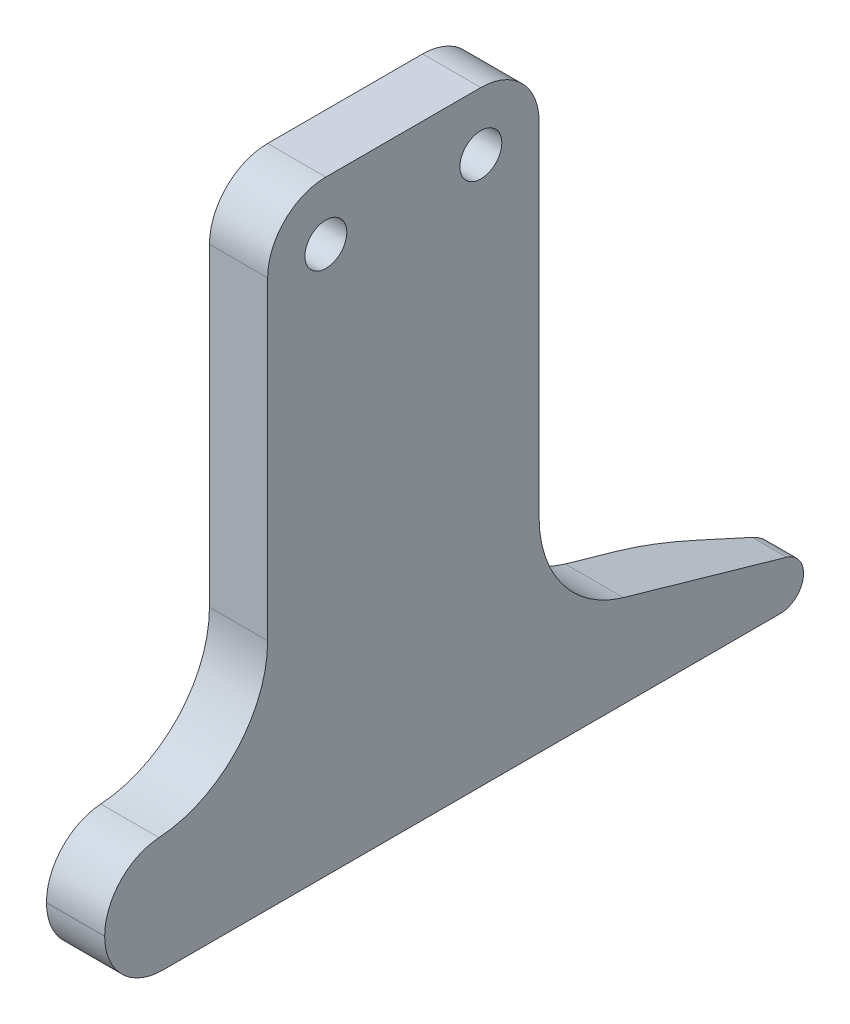
ISO-10303-21;
HEADER;
FILE_DESCRIPTION(('STEP AP214'),'2;1');
FILE_NAME('part.step','',(''),(''),'','','');
FILE_SCHEMA(('AUTOMOTIVE_DESIGN { 1 0 10303 214 1 1 1 1 }'));
ENDSEC;
DATA;
#1=APPLICATION_CONTEXT('core data for automotive mechanical design processes');
#2=APPLICATION_PROTOCOL_DEFINITION('international standard','automotive_design',2000,#1);
#3=PRODUCT_CONTEXT('',#1,'mechanical');
#4=PRODUCT('Part','Part','',(#3));
#5=PRODUCT_RELATED_PRODUCT_CATEGORY('part','',(#4));
#6=PRODUCT_DEFINITION_FORMATION('','',#4);
#7=PRODUCT_DEFINITION_CONTEXT('part definition',#1,'design');
#8=PRODUCT_DEFINITION('design','',#6,#7);
#9=PRODUCT_DEFINITION_SHAPE('','',#8);
#10=(LENGTH_UNIT() NAMED_UNIT(*) SI_UNIT(.MILLI.,.METRE.));
#11=(NAMED_UNIT(*) PLANE_ANGLE_UNIT() SI_UNIT($,.RADIAN.));
#12=(NAMED_UNIT(*) SI_UNIT($,.STERADIAN.) SOLID_ANGLE_UNIT());
#13=UNCERTAINTY_MEASURE_WITH_UNIT(LENGTH_MEASURE(1.E-05),#10,'distance_accuracy_value','');
#14=(GEOMETRIC_REPRESENTATION_CONTEXT(3) GLOBAL_UNCERTAINTY_ASSIGNED_CONTEXT((#13)) GLOBAL_UNIT_ASSIGNED_CONTEXT((#10,
#11,#12)) REPRESENTATION_CONTEXT('',''));
#15=CARTESIAN_POINT('',(0.,0.,0.));
#16=DIRECTION('',(0.,0.,1.));
#17=DIRECTION('',(1.,0.,0.));
#18=AXIS2_PLACEMENT_3D('',#15,#16,#17);
#19=CARTESIAN_POINT('',(6.35,0.,0.));
#20=DIRECTION('',(1.,0.,0.));
#21=DIRECTION('',(0.,0.,-1.));
#22=AXIS2_PLACEMENT_3D('',#19,#20,#21);
#23=PLANE('',#22);
#24=CARTESIAN_POINT('',(6.35,0.,0.));
#25=DIRECTION('',(1.,0.,0.));
#26=DIRECTION('',(0.,0.,-1.));
#27=AXIS2_PLACEMENT_3D('',#24,#25,#26);
#28=CIRCLE('',#27,2.286);
#29=CARTESIAN_POINT('',(6.35,0.,-2.286));
#30=VERTEX_POINT('',#29);
#31=EDGE_CURVE('E313',#30,#30,#28,.T.);
#32=ORIENTED_EDGE('',*,*,#31,.F.);
#33=EDGE_LOOP('',(#32));
#34=FACE_BOUND('',#33,.T.);
#35=DIRECTION('',(0.,0.,-1.));
#36=VECTOR('',#35,1.);
#37=CARTESIAN_POINT('',(6.35,-59.69,24.13));
#38=LINE('',#37,#36);
#39=CARTESIAN_POINT('',(6.35,-59.69,17.78));
#40=VERTEX_POINT('',#39);
#41=CARTESIAN_POINT('',(6.35,-59.69,-49.5760750547068));
#42=VERTEX_POINT('',#41);
#43=EDGE_CURVE('E323',#40,#42,#38,.T.);
#44=ORIENTED_EDGE('',*,*,#43,.T.);
#45=CARTESIAN_POINT('',(6.35,-57.15,-49.5760750547068));
#46=DIRECTION('',(1.,0.,0.));
#47=DIRECTION('',(0.,0.,-1.));
#48=AXIS2_PLACEMENT_3D('',#45,#46,#47);
#49=CIRCLE('',#48,2.54);
#50=CARTESIAN_POINT('',(6.35,-54.7077291729923,-50.2738667195662));
#51=VERTEX_POINT('',#50);
#52=EDGE_CURVE('E157',#42,#51,#49,.T.);
#53=ORIENTED_EDGE('',*,*,#52,.T.);
#54=DIRECTION('',(0.,0.274721127897378,0.961523947640823));
#55=VECTOR('',#54,1.);
#56=CARTESIAN_POINT('',(6.35,-59.69,-67.7118146140931));
#57=LINE('',#56,#55);
#58=CARTESIAN_POINT('',(6.35,-49.6217261930581,-32.4728562897964));
#59=VERTEX_POINT('',#58);
#60=EDGE_CURVE('E301',#51,#59,#57,.T.);
#61=ORIENTED_EDGE('',*,*,#60,.T.);
#62=CARTESIAN_POINT('',(6.35,-37.4103720580196,-35.9618146140931));
#63=DIRECTION('',(1.,0.,0.));
#64=DIRECTION('',(0.,0.,-1.));
#65=AXIS2_PLACEMENT_3D('',#62,#63,#64);
#66=CIRCLE('',#65,12.7);
#67=CARTESIAN_POINT('',(6.35,-37.4103720580196,-23.2618146140931));
#68=VERTEX_POINT('',#67);
#69=EDGE_CURVE('E228',#59,#68,#66,.F.);
#70=ORIENTED_EDGE('',*,*,#69,.T.);
#71=DIRECTION('',(0.,1.,0.));
#72=VECTOR('',#71,1.);
#73=CARTESIAN_POINT('',(6.35,-46.99,-23.2618146140931));
#74=LINE('',#73,#72);
#75=CARTESIAN_POINT('',(6.35,0.,-23.2618146140931));
#76=VERTEX_POINT('',#75);
#77=EDGE_CURVE('E217',#68,#76,#74,.T.);
#78=ORIENTED_EDGE('',*,*,#77,.T.);
#79=CARTESIAN_POINT('',(6.35,0.,-16.9118146140931));
#80=DIRECTION('',(1.,0.,0.));
#81=DIRECTION('',(0.,0.,-1.));
#82=AXIS2_PLACEMENT_3D('',#79,#80,#81);
#83=CIRCLE('',#82,6.35);
#84=CARTESIAN_POINT('',(6.35,6.35,-16.9118146140931));
#85=VERTEX_POINT('',#84);
#86=EDGE_CURVE('E260',#76,#85,#83,.T.);
#87=ORIENTED_EDGE('',*,*,#86,.T.);
#88=DIRECTION('',(0.,0.,1.));
#89=VECTOR('',#88,1.);
#90=CARTESIAN_POINT('',(6.35,6.35,-23.2618146140931));
#91=LINE('',#90,#89);
#92=CARTESIAN_POINT('',(6.35,6.35,0.));
#93=VERTEX_POINT('',#92);
#94=EDGE_CURVE('E211',#85,#93,#91,.T.);
#95=ORIENTED_EDGE('',*,*,#94,.T.);
#96=CARTESIAN_POINT('',(6.35,0.,0.));
#97=DIRECTION('',(1.,0.,0.));
#98=DIRECTION('',(0.,0.,-1.));
#99=AXIS2_PLACEMENT_3D('',#96,#97,#98);
#100=CIRCLE('',#99,6.35);
#101=CARTESIAN_POINT('',(6.35,0.,6.35));
#102=VERTEX_POINT('',#101);
#103=EDGE_CURVE('E263',#93,#102,#100,.T.);
#104=ORIENTED_EDGE('',*,*,#103,.T.);
#105=DIRECTION('',(0.,-1.,0.));
#106=VECTOR('',#105,1.);
#107=CARTESIAN_POINT('',(6.35,6.35,6.35));
#108=LINE('',#107,#106);
#109=CARTESIAN_POINT('',(6.35,-34.29,6.35));
#110=VERTEX_POINT('',#109);
#111=EDGE_CURVE('E330',#102,#110,#108,.T.);
#112=ORIENTED_EDGE('',*,*,#111,.T.);
#113=CARTESIAN_POINT('',(6.35,-34.29,19.05));
#114=DIRECTION('',(1.,0.,0.));
#115=DIRECTION('',(0.,0.,-1.));
#116=AXIS2_PLACEMENT_3D('',#113,#114,#115);
#117=CIRCLE('',#116,12.7);
#118=CARTESIAN_POINT('',(6.35,-46.9617463498744,18.2033333333333));
#119=VERTEX_POINT('',#118);
#120=EDGE_CURVE('E235',#110,#119,#117,.F.);
#121=ORIENTED_EDGE('',*,*,#120,.T.);
#122=CARTESIAN_POINT('',(6.35,-53.2976195248116,17.78));
#123=DIRECTION('',(1.,0.,0.));
#124=DIRECTION('',(0.,0.,-1.));
#125=AXIS2_PLACEMENT_3D('',#122,#123,#124);
#126=CIRCLE('',#125,6.35);
#127=CARTESIAN_POINT('',(6.35,-53.2976195248116,24.13));
#128=VERTEX_POINT('',#127);
#129=EDGE_CURVE('E266',#119,#128,#126,.T.);
#130=ORIENTED_EDGE('',*,*,#129,.T.);
#131=DIRECTION('',(0.,-1.,0.));
#132=VECTOR('',#131,1.);
#133=CARTESIAN_POINT('',(6.35,-46.99,24.13));
#134=LINE('',#133,#132);
#135=CARTESIAN_POINT('',(6.35,-53.34,24.13));
#136=VERTEX_POINT('',#135);
#137=EDGE_CURVE('E326',#128,#136,#134,.T.);
#138=ORIENTED_EDGE('',*,*,#137,.T.);
#139=CARTESIAN_POINT('',(6.35,-53.34,17.78));
#140=DIRECTION('',(1.,0.,0.));
#141=DIRECTION('',(0.,0.,-1.));
#142=AXIS2_PLACEMENT_3D('',#139,#140,#141);
#143=CIRCLE('',#142,6.35);
#144=EDGE_CURVE('E269',#136,#40,#143,.T.);
#145=ORIENTED_EDGE('',*,*,#144,.T.);
#146=EDGE_LOOP('',(#44,#53,#61,#70,#78,#87,#95,#104,#112,#121,#130,#138,#145));
#147=FACE_BOUND('',#146,.T.);
#148=CARTESIAN_POINT('',(6.35,0.,-16.9118146140931));
#149=DIRECTION('',(1.,0.,0.));
#150=DIRECTION('',(0.,0.,-1.));
#151=AXIS2_PLACEMENT_3D('',#148,#149,#150);
#152=CIRCLE('',#151,2.286);
#153=CARTESIAN_POINT('',(6.35,0.,-19.1978146140931));
#154=VERTEX_POINT('',#153);
#155=EDGE_CURVE('E337',#154,#154,#152,.T.);
#156=ORIENTED_EDGE('',*,*,#155,.F.);
#157=EDGE_LOOP('',(#156));
#158=FACE_BOUND('',#157,.T.);
#159=ADVANCED_FACE('F42',(#34,#147,#158),#23,.T.);
#160=CARTESIAN_POINT('',(0.,0.,0.));
#161=DIRECTION('',(1.,0.,0.));
#162=DIRECTION('',(0.,0.,-1.));
#163=AXIS2_PLACEMENT_3D('',#160,#161,#162);
#164=PLANE('',#163);
#165=DIRECTION('',(0.,0.274721127897378,0.961523947640823));
#166=VECTOR('',#165,1.);
#167=CARTESIAN_POINT('',(0.,-59.69,-67.7118146140931));
#168=LINE('',#167,#166);
#169=CARTESIAN_POINT('',(0.,-51.2236980000781,-38.0797576143666));
#170=VERTEX_POINT('',#169);
#171=CARTESIAN_POINT('',(0.,-49.6217261930581,-32.4728562897964));
#172=VERTEX_POINT('',#171);
#173=EDGE_CURVE('E190',#170,#172,#168,.T.);
#174=ORIENTED_EDGE('',*,*,#173,.F.);
#175=DIRECTION('',(0.,-1.,0.));
#176=VECTOR('',#175,1.);
#177=CARTESIAN_POINT('',(0.,0.,-38.0797576143666));
#178=LINE('',#177,#176);
#179=CARTESIAN_POINT('',(0.,-59.69,-38.0797576143666));
#180=VERTEX_POINT('',#179);
#181=EDGE_CURVE('E156',#170,#180,#178,.T.);
#182=ORIENTED_EDGE('',*,*,#181,.T.);
#183=DIRECTION('',(0.,0.,-1.));
#184=VECTOR('',#183,1.);
#185=CARTESIAN_POINT('',(0.,-59.69,24.13));
#186=LINE('',#185,#184);
#187=CARTESIAN_POINT('',(0.,-59.69,17.78));
#188=VERTEX_POINT('',#187);
#189=EDGE_CURVE('E188',#188,#180,#186,.T.);
#190=ORIENTED_EDGE('',*,*,#189,.F.);
#191=CARTESIAN_POINT('',(0.,-53.34,17.78));
#192=DIRECTION('',(1.,0.,0.));
#193=DIRECTION('',(0.,0.,-1.));
#194=AXIS2_PLACEMENT_3D('',#191,#192,#193);
#195=CIRCLE('',#194,6.35);
#196=CARTESIAN_POINT('',(0.,-53.34,24.13));
#197=VERTEX_POINT('',#196);
#198=EDGE_CURVE('E250',#188,#197,#195,.F.);
#199=ORIENTED_EDGE('',*,*,#198,.T.);
#200=DIRECTION('',(0.,-1.,0.));
#201=VECTOR('',#200,1.);
#202=CARTESIAN_POINT('',(0.,-46.99,24.13));
#203=LINE('',#202,#201);
#204=CARTESIAN_POINT('',(0.,-53.2976195248116,24.13));
#205=VERTEX_POINT('',#204);
#206=EDGE_CURVE('E197',#205,#197,#203,.T.);
#207=ORIENTED_EDGE('',*,*,#206,.F.);
#208=CARTESIAN_POINT('',(0.,-53.2976195248116,17.78));
#209=DIRECTION('',(1.,0.,0.));
#210=DIRECTION('',(0.,0.,-1.));
#211=AXIS2_PLACEMENT_3D('',#208,#209,#210);
#212=CIRCLE('',#211,6.35);
#213=CARTESIAN_POINT('',(0.,-46.9617463498744,18.2033333333333));
#214=VERTEX_POINT('',#213);
#215=EDGE_CURVE('E247',#205,#214,#212,.F.);
#216=ORIENTED_EDGE('',*,*,#215,.T.);
#217=CARTESIAN_POINT('',(0.,-34.29,19.05));
#218=DIRECTION('',(1.,0.,0.));
#219=DIRECTION('',(0.,0.,-1.));
#220=AXIS2_PLACEMENT_3D('',#217,#218,#219);
#221=CIRCLE('',#220,12.7);
#222=CARTESIAN_POINT('',(0.,-34.29,6.35));
#223=VERTEX_POINT('',#222);
#224=EDGE_CURVE('E231',#214,#223,#221,.T.);
#225=ORIENTED_EDGE('',*,*,#224,.T.);
#226=DIRECTION('',(0.,-1.,0.));
#227=VECTOR('',#226,1.);
#228=CARTESIAN_POINT('',(0.,6.35,6.35));
#229=LINE('',#228,#227);
#230=CARTESIAN_POINT('',(0.,0.,6.35));
#231=VERTEX_POINT('',#230);
#232=EDGE_CURVE('E204',#231,#223,#229,.T.);
#233=ORIENTED_EDGE('',*,*,#232,.F.);
#234=CARTESIAN_POINT('',(0.,0.,0.));
#235=DIRECTION('',(1.,0.,0.));
#236=DIRECTION('',(0.,0.,-1.));
#237=AXIS2_PLACEMENT_3D('',#234,#235,#236);
#238=CIRCLE('',#237,6.35);
#239=CARTESIAN_POINT('',(0.,6.35,0.));
#240=VERTEX_POINT('',#239);
#241=EDGE_CURVE('E244',#231,#240,#238,.F.);
#242=ORIENTED_EDGE('',*,*,#241,.T.);
#243=DIRECTION('',(0.,0.,1.));
#244=VECTOR('',#243,1.);
#245=CARTESIAN_POINT('',(0.,6.35,-23.2618146140931));
#246=LINE('',#245,#244);
#247=CARTESIAN_POINT('',(0.,6.35,-16.9118146140931));
#248=VERTEX_POINT('',#247);
#249=EDGE_CURVE('E309',#248,#240,#246,.T.);
#250=ORIENTED_EDGE('',*,*,#249,.F.);
#251=CARTESIAN_POINT('',(0.,0.,-16.9118146140931));
#252=DIRECTION('',(1.,0.,0.));
#253=DIRECTION('',(0.,0.,-1.));
#254=AXIS2_PLACEMENT_3D('',#251,#252,#253);
#255=CIRCLE('',#254,6.35);
#256=CARTESIAN_POINT('',(0.,0.,-23.2618146140931));
#257=VERTEX_POINT('',#256);
#258=EDGE_CURVE('E241',#248,#257,#255,.F.);
#259=ORIENTED_EDGE('',*,*,#258,.T.);
#260=DIRECTION('',(0.,1.,0.));
#261=VECTOR('',#260,1.);
#262=CARTESIAN_POINT('',(0.,-46.99,-23.2618146140931));
#263=LINE('',#262,#261);
#264=CARTESIAN_POINT('',(0.,-37.4103720580196,-23.2618146140931));
#265=VERTEX_POINT('',#264);
#266=EDGE_CURVE('E201',#265,#257,#263,.T.);
#267=ORIENTED_EDGE('',*,*,#266,.F.);
#268=CARTESIAN_POINT('',(0.,-37.4103720580196,-35.9618146140931));
#269=DIRECTION('',(1.,0.,0.));
#270=DIRECTION('',(0.,0.,-1.));
#271=AXIS2_PLACEMENT_3D('',#268,#269,#270);
#272=CIRCLE('',#271,12.7);
#273=EDGE_CURVE('E225',#265,#172,#272,.T.);
#274=ORIENTED_EDGE('',*,*,#273,.T.);
#275=EDGE_LOOP('',(#174,#182,#190,#199,#207,#216,#225,#233,#242,#250,#259,#267,#274));
#276=FACE_BOUND('',#275,.T.);
#277=CARTESIAN_POINT('',(0.,0.,0.));
#278=DIRECTION('',(1.,0.,0.));
#279=DIRECTION('',(0.,0.,-1.));
#280=AXIS2_PLACEMENT_3D('',#277,#278,#279);
#281=CIRCLE('',#280,2.286);
#282=CARTESIAN_POINT('',(0.,0.,-2.286));
#283=VERTEX_POINT('',#282);
#284=EDGE_CURVE('E318',#283,#283,#281,.T.);
#285=ORIENTED_EDGE('',*,*,#284,.T.);
#286=EDGE_LOOP('',(#285));
#287=FACE_BOUND('',#286,.T.);
#288=CARTESIAN_POINT('',(0.,0.,-16.9118146140931));
#289=DIRECTION('',(1.,0.,0.));
#290=DIRECTION('',(0.,0.,-1.));
#291=AXIS2_PLACEMENT_3D('',#288,#289,#290);
#292=CIRCLE('',#291,2.286);
#293=CARTESIAN_POINT('',(0.,0.,-19.1978146140931));
#294=VERTEX_POINT('',#293);
#295=EDGE_CURVE('E339',#294,#294,#292,.T.);
#296=ORIENTED_EDGE('',*,*,#295,.T.);
#297=EDGE_LOOP('',(#296));
#298=FACE_BOUND('',#297,.T.);
#299=ADVANCED_FACE('F186',(#276,#287,#298),#164,.F.);
#300=CARTESIAN_POINT('',(6.35,6.35,-23.2618146140931));
#301=DIRECTION('',(0.,-1.,0.));
#302=DIRECTION('',(0.,0.,-1.));
#303=AXIS2_PLACEMENT_3D('',#300,#301,#302);
#304=PLANE('',#303);
#305=ORIENTED_EDGE('',*,*,#249,.T.);
#306=DIRECTION('',(-1.,0.,0.));
#307=VECTOR('',#306,1.);
#308=CARTESIAN_POINT('',(6.35,6.35,0.));
#309=LINE('',#308,#307);
#310=EDGE_CURVE('E283',#240,#93,#309,.F.);
#311=ORIENTED_EDGE('',*,*,#310,.T.);
#312=ORIENTED_EDGE('',*,*,#94,.F.);
#313=DIRECTION('',(-1.,0.,0.));
#314=VECTOR('',#313,1.);
#315=CARTESIAN_POINT('',(6.35,6.35,-16.9118146140931));
#316=LINE('',#315,#314);
#317=EDGE_CURVE('E279',#85,#248,#316,.T.);
#318=ORIENTED_EDGE('',*,*,#317,.T.);
#319=EDGE_LOOP('',(#305,#311,#312,#318));
#320=FACE_BOUND('',#319,.T.);
#321=ADVANCED_FACE('F308',(#320),#304,.F.);
#322=CARTESIAN_POINT('',(6.35,6.35,6.35));
#323=DIRECTION('',(0.,0.,-1.));
#324=DIRECTION('',(0.,1.,0.));
#325=AXIS2_PLACEMENT_3D('',#322,#323,#324);
#326=PLANE('',#325);
#327=ORIENTED_EDGE('',*,*,#111,.F.);
#328=DIRECTION('',(-1.,0.,0.));
#329=VECTOR('',#328,1.);
#330=CARTESIAN_POINT('',(6.35,0.,6.35));
#331=LINE('',#330,#329);
#332=EDGE_CURVE('E275',#102,#231,#331,.T.);
#333=ORIENTED_EDGE('',*,*,#332,.T.);
#334=ORIENTED_EDGE('',*,*,#232,.T.);
#335=DIRECTION('',(-1.,0.,0.));
#336=VECTOR('',#335,1.);
#337=CARTESIAN_POINT('',(6.35,-34.29,6.35));
#338=LINE('',#337,#336);
#339=EDGE_CURVE('E221',#223,#110,#338,.F.);
#340=ORIENTED_EDGE('',*,*,#339,.T.);
#341=EDGE_LOOP('',(#327,#333,#334,#340));
#342=FACE_BOUND('',#341,.T.);
#343=ADVANCED_FACE('F377',(#342),#326,.F.);
#344=CARTESIAN_POINT('',(6.35,-46.99,24.13));
#345=DIRECTION('',(0.,0.,-1.));
#346=DIRECTION('',(-1.,0.,0.));
#347=AXIS2_PLACEMENT_3D('',#344,#345,#346);
#348=PLANE('',#347);
#349=ORIENTED_EDGE('',*,*,#206,.T.);
#350=DIRECTION('',(-1.,0.,0.));
#351=VECTOR('',#350,1.);
#352=CARTESIAN_POINT('',(6.35,-53.34,24.13));
#353=LINE('',#352,#351);
#354=EDGE_CURVE('E257',#197,#136,#353,.F.);
#355=ORIENTED_EDGE('',*,*,#354,.T.);
#356=ORIENTED_EDGE('',*,*,#137,.F.);
#357=DIRECTION('',(1.,0.,0.));
#358=VECTOR('',#357,1.);
#359=CARTESIAN_POINT('',(6.35,-53.2976195248116,24.13));
#360=LINE('',#359,#358);
#361=EDGE_CURVE('E253',#128,#205,#360,.F.);
#362=ORIENTED_EDGE('',*,*,#361,.T.);
#363=EDGE_LOOP('',(#349,#355,#356,#362));
#364=FACE_BOUND('',#363,.T.);
#365=ADVANCED_FACE('F374',(#364),#348,.F.);
#366=CARTESIAN_POINT('',(6.35,-59.69,24.13));
#367=DIRECTION('',(0.,1.,0.));
#368=DIRECTION('',(0.,0.,1.));
#369=AXIS2_PLACEMENT_3D('',#366,#367,#368);
#370=PLANE('',#369);
#371=ORIENTED_EDGE('',*,*,#189,.T.);
#372=CARTESIAN_POINT('',(25.4,-59.69,-38.0797576143666));
#373=DIRECTION('',(0.,1.,0.));
#374=DIRECTION('',(0.,0.,1.));
#375=AXIS2_PLACEMENT_3D('',#372,#373,#374);
#376=CIRCLE('',#375,25.4);
#377=CARTESIAN_POINT('',(1.15620855791024,-59.69,-45.6559424400196));
#378=VERTEX_POINT('',#377);
#379=EDGE_CURVE('E65',#180,#378,#376,.F.);
#380=ORIENTED_EDGE('',*,*,#379,.T.);
#381=DIRECTION('',(-0.298274993135947,0.,0.95447997803503));
#382=VECTOR('',#381,1.);
#383=CARTESIAN_POINT('',(0.,-59.69,-41.9560750547068));
#384=LINE('',#383,#382);
#385=CARTESIAN_POINT('',(2.38125,-59.69,-49.5760750547068));
#386=VERTEX_POINT('',#385);
#387=EDGE_CURVE('E149',#386,#378,#384,.T.);
#388=ORIENTED_EDGE('',*,*,#387,.F.);
#389=DIRECTION('',(-1.,0.,0.));
#390=VECTOR('',#389,1.);
#391=CARTESIAN_POINT('',(6.35,-59.69,-49.5760750547068));
#392=LINE('',#391,#390);
#393=EDGE_CURVE('E161',#386,#42,#392,.F.);
#394=ORIENTED_EDGE('',*,*,#393,.T.);
#395=ORIENTED_EDGE('',*,*,#43,.F.);
#396=DIRECTION('',(-1.,0.,0.));
#397=VECTOR('',#396,1.);
#398=CARTESIAN_POINT('',(6.35,-59.69,17.78));
#399=LINE('',#398,#397);
#400=EDGE_CURVE('E195',#40,#188,#399,.T.);
#401=ORIENTED_EDGE('',*,*,#400,.T.);
#402=EDGE_LOOP('',(#371,#380,#388,#394,#395,#401));
#403=FACE_BOUND('',#402,.T.);
#404=ADVANCED_FACE('F159',(#403),#370,.F.);
#405=CARTESIAN_POINT('',(6.35,-59.69,-67.7118146140931));
#406=DIRECTION('',(0.,-0.961523947640823,0.274721127897378));
#407=DIRECTION('',(0.,-0.274721127897378,-0.961523947640823));
#408=AXIS2_PLACEMENT_3D('',#405,#406,#407);
#409=PLANE('',#408);
#410=DIRECTION('',(-0.287766288671604,0.263100606785467,0.920852123749134));
#411=VECTOR('',#410,1.);
#412=CARTESIAN_POINT('',(7.90800282105034,-59.5613912765643,-67.2616840820679));
#413=LINE('',#412,#411);
#414=CARTESIAN_POINT('',(2.59930989526854,-54.7077291729923,-50.2738667195662));
#415=VERTEX_POINT('',#414);
#416=CARTESIAN_POINT('',(1.15620855791024,-53.388322235979,-45.6559424400196));
#417=VERTEX_POINT('',#416);
#418=EDGE_CURVE('E150',#415,#417,#413,.T.);
#419=ORIENTED_EDGE('',*,*,#418,.T.);
#420=CARTESIAN_POINT('',(25.4,-51.2236980000781,-38.0797576143666));
#421=DIRECTION('',(0.,-0.961523947640823,0.274721127897378));
#422=DIRECTION('',(0.,-0.274721127897378,-0.961523947640823));
#423=AXIS2_PLACEMENT_3D('',#420,#421,#422);
#424=ELLIPSE('',#423,26.4163987411036,25.4);
#425=EDGE_CURVE('E11',#417,#170,#424,.F.);
#426=ORIENTED_EDGE('',*,*,#425,.T.);
#427=ORIENTED_EDGE('',*,*,#173,.T.);
#428=DIRECTION('',(-1.,0.,0.));
#429=VECTOR('',#428,1.);
#430=CARTESIAN_POINT('',(6.35,-49.6217261930581,-32.4728562897964));
#431=LINE('',#430,#429);
#432=EDGE_CURVE('E216',#172,#59,#431,.F.);
#433=ORIENTED_EDGE('',*,*,#432,.T.);
#434=ORIENTED_EDGE('',*,*,#60,.F.);
#435=DIRECTION('',(-1.,0.,0.));
#436=VECTOR('',#435,1.);
#437=CARTESIAN_POINT('',(6.35,-54.7077291729923,-50.2738667195662));
#438=LINE('',#437,#436);
#439=EDGE_CURVE('E168',#51,#415,#438,.T.);
#440=ORIENTED_EDGE('',*,*,#439,.T.);
#441=EDGE_LOOP('',(#419,#426,#427,#433,#434,#440));
#442=FACE_BOUND('',#441,.T.);
#443=ADVANCED_FACE('F348',(#442),#409,.F.);
#444=CARTESIAN_POINT('',(6.35,-46.99,-23.2618146140931));
#445=DIRECTION('',(0.,0.,1.));
#446=DIRECTION('',(0.,-1.,0.));
#447=AXIS2_PLACEMENT_3D('',#444,#445,#446);
#448=PLANE('',#447);
#449=ORIENTED_EDGE('',*,*,#266,.T.);
#450=DIRECTION('',(-1.,0.,0.));
#451=VECTOR('',#450,1.);
#452=CARTESIAN_POINT('',(6.35,0.,-23.2618146140931));
#453=LINE('',#452,#451);
#454=EDGE_CURVE('E173',#257,#76,#453,.F.);
#455=ORIENTED_EDGE('',*,*,#454,.T.);
#456=ORIENTED_EDGE('',*,*,#77,.F.);
#457=DIRECTION('',(-1.,0.,0.));
#458=VECTOR('',#457,1.);
#459=CARTESIAN_POINT('',(0.,-37.4103720580196,-23.2618146140931));
#460=LINE('',#459,#458);
#461=EDGE_CURVE('E212',#68,#265,#460,.T.);
#462=ORIENTED_EDGE('',*,*,#461,.T.);
#463=EDGE_LOOP('',(#449,#455,#456,#462));
#464=FACE_BOUND('',#463,.T.);
#465=ADVANCED_FACE('F290',(#464),#448,.F.);
#466=CARTESIAN_POINT('',(6.35,0.,0.));
#467=DIRECTION('',(-1.,0.,0.));
#468=DIRECTION('',(0.,0.,1.));
#469=AXIS2_PLACEMENT_3D('',#466,#467,#468);
#470=CYLINDRICAL_SURFACE('',#469,2.286);
#471=ORIENTED_EDGE('',*,*,#31,.T.);
#472=EDGE_LOOP('',(#471));
#473=FACE_BOUND('',#472,.T.);
#474=ORIENTED_EDGE('',*,*,#284,.F.);
#475=EDGE_LOOP('',(#474));
#476=FACE_BOUND('',#475,.T.);
#477=ADVANCED_FACE('F365',(#473,#476),#470,.F.);
#478=CARTESIAN_POINT('',(6.35,0.,-16.9118146140931));
#479=DIRECTION('',(-1.,0.,0.));
#480=DIRECTION('',(0.,0.,1.));
#481=AXIS2_PLACEMENT_3D('',#478,#479,#480);
#482=CYLINDRICAL_SURFACE('',#481,2.286);
#483=ORIENTED_EDGE('',*,*,#155,.T.);
#484=EDGE_LOOP('',(#483));
#485=FACE_BOUND('',#484,.T.);
#486=ORIENTED_EDGE('',*,*,#295,.F.);
#487=EDGE_LOOP('',(#486));
#488=FACE_BOUND('',#487,.T.);
#489=ADVANCED_FACE('F388',(#485,#488),#482,.F.);
#490=CARTESIAN_POINT('',(6.35,-37.4103720580196,-35.9618146140931));
#491=DIRECTION('',(1.,0.,0.));
#492=DIRECTION('',(0.,0.,-1.));
#493=AXIS2_PLACEMENT_3D('',#490,#491,#492);
#494=CYLINDRICAL_SURFACE('',#493,12.7);
#495=ORIENTED_EDGE('',*,*,#69,.F.);
#496=ORIENTED_EDGE('',*,*,#432,.F.);
#497=ORIENTED_EDGE('',*,*,#273,.F.);
#498=ORIENTED_EDGE('',*,*,#461,.F.);
#499=EDGE_LOOP('',(#495,#496,#497,#498));
#500=FACE_BOUND('',#499,.T.);
#501=ADVANCED_FACE('F384',(#500),#494,.F.);
#502=CARTESIAN_POINT('',(6.35,-34.29,19.05));
#503=DIRECTION('',(1.,0.,0.));
#504=DIRECTION('',(0.,0.,-1.));
#505=AXIS2_PLACEMENT_3D('',#502,#503,#504);
#506=CYLINDRICAL_SURFACE('',#505,12.7);
#507=ORIENTED_EDGE('',*,*,#224,.F.);
#508=DIRECTION('',(1.,0.,0.));
#509=VECTOR('',#508,1.);
#510=CARTESIAN_POINT('',(6.35,-46.9617463498744,18.2033333333333));
#511=LINE('',#510,#509);
#512=EDGE_CURVE('E272',#214,#119,#511,.T.);
#513=ORIENTED_EDGE('',*,*,#512,.T.);
#514=ORIENTED_EDGE('',*,*,#120,.F.);
#515=ORIENTED_EDGE('',*,*,#339,.F.);
#516=EDGE_LOOP('',(#507,#513,#514,#515));
#517=FACE_BOUND('',#516,.T.);
#518=ADVANCED_FACE('F387',(#517),#506,.F.);
#519=CARTESIAN_POINT('',(6.35,-53.34,17.78));
#520=DIRECTION('',(-1.,0.,0.));
#521=DIRECTION('',(0.,0.,1.));
#522=AXIS2_PLACEMENT_3D('',#519,#520,#521);
#523=CYLINDRICAL_SURFACE('',#522,6.35);
#524=ORIENTED_EDGE('',*,*,#144,.F.);
#525=ORIENTED_EDGE('',*,*,#354,.F.);
#526=ORIENTED_EDGE('',*,*,#198,.F.);
#527=ORIENTED_EDGE('',*,*,#400,.F.);
#528=EDGE_LOOP('',(#524,#525,#526,#527));
#529=FACE_BOUND('',#528,.T.);
#530=ADVANCED_FACE('F392',(#529),#523,.T.);
#531=CARTESIAN_POINT('',(6.35,-53.2976195248116,17.78));
#532=DIRECTION('',(1.,0.,0.));
#533=DIRECTION('',(0.,0.,-1.));
#534=AXIS2_PLACEMENT_3D('',#531,#532,#533);
#535=CYLINDRICAL_SURFACE('',#534,6.35);
#536=ORIENTED_EDGE('',*,*,#129,.F.);
#537=ORIENTED_EDGE('',*,*,#512,.F.);
#538=ORIENTED_EDGE('',*,*,#215,.F.);
#539=ORIENTED_EDGE('',*,*,#361,.F.);
#540=EDGE_LOOP('',(#536,#537,#538,#539));
#541=FACE_BOUND('',#540,.T.);
#542=ADVANCED_FACE('F396',(#541),#535,.T.);
#543=CARTESIAN_POINT('',(6.35,0.,0.));
#544=DIRECTION('',(-1.,0.,0.));
#545=DIRECTION('',(0.,0.,1.));
#546=AXIS2_PLACEMENT_3D('',#543,#544,#545);
#547=CYLINDRICAL_SURFACE('',#546,6.35);
#548=ORIENTED_EDGE('',*,*,#103,.F.);
#549=ORIENTED_EDGE('',*,*,#310,.F.);
#550=ORIENTED_EDGE('',*,*,#241,.F.);
#551=ORIENTED_EDGE('',*,*,#332,.F.);
#552=EDGE_LOOP('',(#548,#549,#550,#551));
#553=FACE_BOUND('',#552,.T.);
#554=ADVANCED_FACE('F400',(#553),#547,.T.);
#555=CARTESIAN_POINT('',(6.35,0.,-16.9118146140931));
#556=DIRECTION('',(-1.,0.,0.));
#557=DIRECTION('',(0.,0.,1.));
#558=AXIS2_PLACEMENT_3D('',#555,#556,#557);
#559=CYLINDRICAL_SURFACE('',#558,6.35);
#560=ORIENTED_EDGE('',*,*,#86,.F.);
#561=ORIENTED_EDGE('',*,*,#454,.F.);
#562=ORIENTED_EDGE('',*,*,#258,.F.);
#563=ORIENTED_EDGE('',*,*,#317,.F.);
#564=EDGE_LOOP('',(#560,#561,#562,#563));
#565=FACE_BOUND('',#564,.T.);
#566=ADVANCED_FACE('F304',(#565),#559,.T.);
#567=CARTESIAN_POINT('',(6.35,-57.15,-49.5760750547068));
#568=DIRECTION('',(-1.,0.,0.));
#569=DIRECTION('',(0.,0.,1.));
#570=AXIS2_PLACEMENT_3D('',#567,#568,#569);
#571=CYLINDRICAL_SURFACE('',#570,2.54);
#572=ORIENTED_EDGE('',*,*,#393,.F.);
#573=CARTESIAN_POINT('',(2.38125,-57.15,-49.5760750547068));
#574=DIRECTION('',(0.95447997803503,0.,0.298274993135947));
#575=DIRECTION('',(-0.298274993135947,0.,0.95447997803503));
#576=AXIS2_PLACEMENT_3D('',#573,#574,#575);
#577=ELLIPSE('',#576,2.66113492001063,2.54);
#578=EDGE_CURVE('E147',#415,#386,#577,.F.);
#579=ORIENTED_EDGE('',*,*,#578,.F.);
#580=ORIENTED_EDGE('',*,*,#439,.F.);
#581=ORIENTED_EDGE('',*,*,#52,.F.);
#582=EDGE_LOOP('',(#572,#579,#580,#581));
#583=FACE_BOUND('',#582,.T.);
#584=ADVANCED_FACE('F166',(#583),#571,.T.);
#585=CARTESIAN_POINT('',(0.,6.34999999999999,-41.9560750547068));
#586=DIRECTION('',(0.95447997803503,0.,0.298274993135947));
#587=DIRECTION('',(0.298274993135947,0.,-0.95447997803503));
#588=AXIS2_PLACEMENT_3D('',#585,#586,#587);
#589=PLANE('',#588);
#590=ORIENTED_EDGE('',*,*,#387,.T.);
#591=DIRECTION('',(0.,-1.,0.));
#592=VECTOR('',#591,1.);
#593=CARTESIAN_POINT('',(1.15620855791024,6.34999999999999,-45.6559424400196));
#594=LINE('',#593,#592);
#595=EDGE_CURVE('E51',#378,#417,#594,.F.);
#596=ORIENTED_EDGE('',*,*,#595,.T.);
#597=ORIENTED_EDGE('',*,*,#418,.F.);
#598=ORIENTED_EDGE('',*,*,#578,.T.);
#599=EDGE_LOOP('',(#590,#596,#597,#598));
#600=FACE_BOUND('',#599,.T.);
#601=ADVANCED_FACE('F148',(#600),#589,.F.);
#602=CARTESIAN_POINT('',(25.4,0.,-38.0797576143666));
#603=DIRECTION('',(0.,-1.,0.));
#604=DIRECTION('',(0.,0.,-1.));
#605=AXIS2_PLACEMENT_3D('',#602,#603,#604);
#606=CYLINDRICAL_SURFACE('',#605,25.4);
#607=ORIENTED_EDGE('',*,*,#425,.F.);
#608=ORIENTED_EDGE('',*,*,#595,.F.);
#609=ORIENTED_EDGE('',*,*,#379,.F.);
#610=ORIENTED_EDGE('',*,*,#181,.F.);
#611=EDGE_LOOP('',(#607,#608,#609,#610));
#612=FACE_BOUND('',#611,.T.);
#613=ADVANCED_FACE('F44',(#612),#606,.T.);
#614=CLOSED_SHELL('',(#159,#299,#321,#343,#365,#404,#443,#465,#477,#489,#501,#518,#530,#542,
#554,#566,#584,#601,#613));
#615=MANIFOLD_SOLID_BREP('B2',#614);
#616=ADVANCED_BREP_SHAPE_REPRESENTATION('',(#18,#615),#14);
#617=SHAPE_DEFINITION_REPRESENTATION(#9,#616);
ENDSEC;
END-ISO-10303-21;
